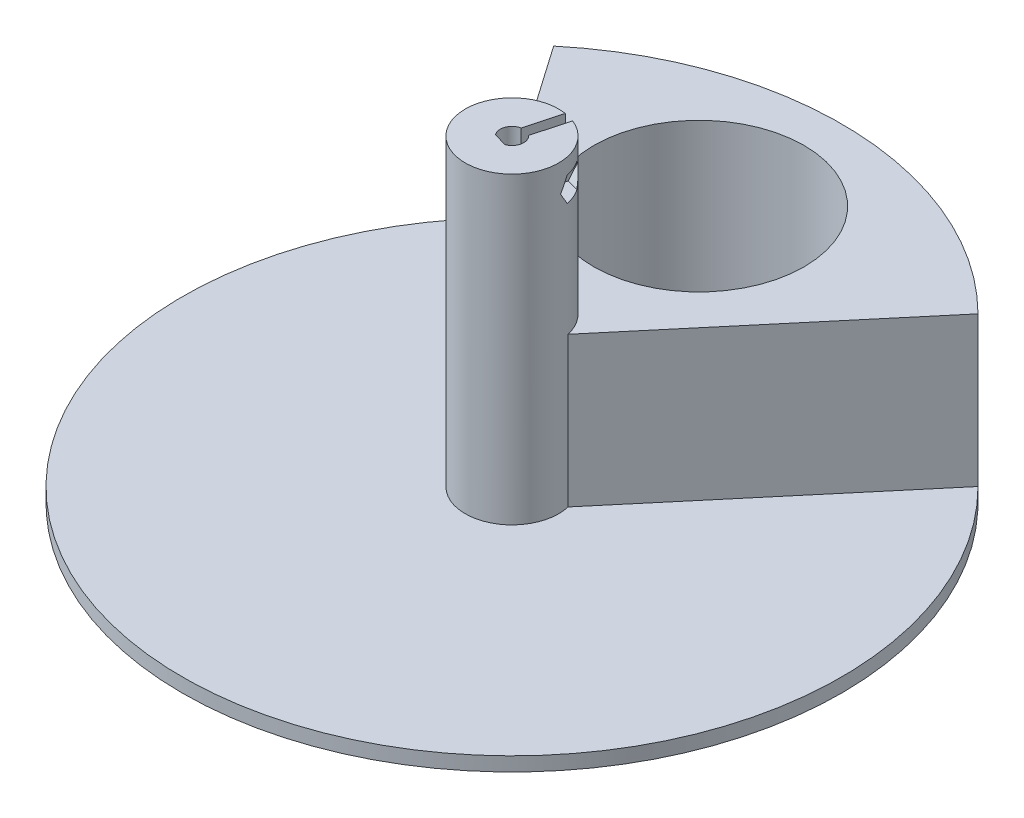
ISO-10303-21;
HEADER;
FILE_DESCRIPTION(('STEP AP214'),'2;1');
FILE_NAME('part.step','',(''),(''),'','','');
FILE_SCHEMA(('AUTOMOTIVE_DESIGN { 1 0 10303 214 1 1 1 1 }'));
ENDSEC;
DATA;
#1=APPLICATION_CONTEXT('core data for automotive mechanical design processes');
#2=APPLICATION_PROTOCOL_DEFINITION('international standard','automotive_design',2000,#1);
#3=PRODUCT_CONTEXT('',#1,'mechanical');
#4=PRODUCT('Part','Part','',(#3));
#5=PRODUCT_RELATED_PRODUCT_CATEGORY('part','',(#4));
#6=PRODUCT_DEFINITION_FORMATION('','',#4);
#7=PRODUCT_DEFINITION_CONTEXT('part definition',#1,'design');
#8=PRODUCT_DEFINITION('design','',#6,#7);
#9=PRODUCT_DEFINITION_SHAPE('','',#8);
#10=(LENGTH_UNIT() NAMED_UNIT(*) SI_UNIT(.MILLI.,.METRE.));
#11=(NAMED_UNIT(*) PLANE_ANGLE_UNIT() SI_UNIT($,.RADIAN.));
#12=(NAMED_UNIT(*) SI_UNIT($,.STERADIAN.) SOLID_ANGLE_UNIT());
#13=UNCERTAINTY_MEASURE_WITH_UNIT(LENGTH_MEASURE(1.E-05),#10,'distance_accuracy_value','');
#14=(GEOMETRIC_REPRESENTATION_CONTEXT(3) GLOBAL_UNCERTAINTY_ASSIGNED_CONTEXT((#13)) GLOBAL_UNIT_ASSIGNED_CONTEXT((#10,
#11,#12)) REPRESENTATION_CONTEXT('',''));
#15=CARTESIAN_POINT('',(0.,0.,0.));
#16=DIRECTION('',(0.,0.,1.));
#17=DIRECTION('',(1.,0.,0.));
#18=AXIS2_PLACEMENT_3D('',#15,#16,#17);
#19=CARTESIAN_POINT('',(12.0838405350801,62.,-2.99039942054655));
#20=DIRECTION('',(-0.964927464953348,0.,-0.262516642098564));
#21=DIRECTION('',(-0.262516642098564,0.,0.964927464953348));
#22=AXIS2_PLACEMENT_3D('',#19,#20,#21);
#23=CYLINDRICAL_SURFACE('',#22,1.55);
#24=CARTESIAN_POINT('',(0.504710955639954,62.,-6.14059912572932));
#25=DIRECTION('',(-0.964927464953348,0.,-0.262516642098564));
#26=DIRECTION('',(-0.262516642098564,0.,0.964927464953348));
#27=AXIS2_PLACEMENT_3D('',#24,#25,#26);
#28=CIRCLE('',#27,1.55);
#29=CARTESIAN_POINT('',(0.0978101603871794,62.,-4.64496155505163));
#30=VERTEX_POINT('',#29);
#31=EDGE_CURVE('E217',#30,#30,#28,.F.);
#32=ORIENTED_EDGE('',*,*,#31,.T.);
#33=EDGE_LOOP('',(#32));
#34=FACE_BOUND('',#33,.T.);
#35=CARTESIAN_POINT('',(-2.14883957298176,62.,-6.86251989150038));
#36=DIRECTION('',(-0.964927464953348,0.,-0.262516642098564));
#37=DIRECTION('',(-0.262516642098564,0.,0.964927464953348));
#38=AXIS2_PLACEMENT_3D('',#35,#36,#37);
#39=CIRCLE('',#38,1.55);
#40=CARTESIAN_POINT('',(-2.55574036823453,62.,-5.36688232082269));
#41=VERTEX_POINT('',#40);
#42=EDGE_CURVE('E193',#41,#41,#39,.T.);
#43=ORIENTED_EDGE('',*,*,#42,.T.);
#44=EDGE_LOOP('',(#43));
#45=FACE_BOUND('',#44,.T.);
#46=ADVANCED_FACE('F38',(#34,#45),#23,.F.);
#47=CARTESIAN_POINT('',(2.67579775178499,62.,-5.54993668100755));
#48=DIRECTION('',(0.964927464953348,0.,0.262516642098564));
#49=DIRECTION('',(0.262516642098564,0.,-0.964927464953348));
#50=AXIS2_PLACEMENT_3D('',#47,#48,#49);
#51=CIRCLE('',#50,1.55);
#52=CARTESIAN_POINT('',(3.08269854703776,62.,-7.04557425168524));
#53=VERTEX_POINT('',#52);
#54=EDGE_CURVE('E221',#53,#53,#51,.F.);
#55=ORIENTED_EDGE('',*,*,#54,.T.);
#56=EDGE_LOOP('',(#55));
#57=FACE_BOUND('',#56,.T.);
#58=CARTESIAN_POINT('',(5.3293482804067,62.,-4.8280159152365));
#59=DIRECTION('',(0.964927464953348,0.,0.262516642098565));
#60=DIRECTION('',(0.262516642098565,0.,-0.964927464953348));
#61=AXIS2_PLACEMENT_3D('',#58,#59,#60);
#62=CIRCLE('',#61,1.55);
#63=CARTESIAN_POINT('',(5.73624907565948,62.,-6.32365348591419));
#64=VERTEX_POINT('',#63);
#65=EDGE_CURVE('E206',#64,#64,#62,.T.);
#66=ORIENTED_EDGE('',*,*,#65,.T.);
#67=EDGE_LOOP('',(#66));
#68=FACE_BOUND('',#67,.T.);
#69=ADVANCED_FACE('F355',(#57,#68),#23,.F.);
#70=CARTESIAN_POINT('',(0.,68.,0.));
#71=DIRECTION('',(0.,-1.,0.));
#72=DIRECTION('',(0.,0.,-1.));
#73=AXIS2_PLACEMENT_3D('',#70,#71,#72);
#74=CYLINDRICAL_SURFACE('',#73,10.);
#75=CARTESIAN_POINT('',(-8.4128944018716,62.,-5.40584940439128));
#76=CARTESIAN_POINT('',(-8.4128933177047,61.836429564872,-5.40585810801379));
#77=CARTESIAN_POINT('',(-8.40543360582333,61.6726981942952,-5.41751535518966));
#78=CARTESIAN_POINT('',(-8.37549125315974,61.3497173095908,-5.46368682018151));
#79=CARTESIAN_POINT('',(-8.35298481801678,61.1904753111223,-5.49823723968637));
#80=CARTESIAN_POINT('',(-8.29277333656487,60.8812808585193,-5.58863497408555));
#81=CARTESIAN_POINT('',(-8.25507913418459,60.7313218643465,-5.64446709250712));
#82=CARTESIAN_POINT('',(-8.16440083669899,60.4448556112467,-5.77484451229425));
#83=CARTESIAN_POINT('',(-8.11142315822704,60.3083427392814,-5.84938195868668));
#84=CARTESIAN_POINT('',(-7.99014270207121,60.0518665768216,-6.01398926154527));
#85=CARTESIAN_POINT('',(-7.92179020363087,59.9319590660187,-6.10410928690612));
#86=CARTESIAN_POINT('',(-7.7705186207467,59.7119461466983,-6.2955456984177));
#87=CARTESIAN_POINT('',(-7.6875981675094,59.6118426008263,-6.39686313633631));
#88=CARTESIAN_POINT('',(-7.50574546192819,59.4303404124941,-6.60937860047187));
#89=CARTESIAN_POINT('',(-7.4064099621458,59.3495874761086,-6.72078100139821));
#90=CARTESIAN_POINT('',(-7.19546692999195,59.2110747134056,-6.94615688705542));
#91=CARTESIAN_POINT('',(-7.08385579958623,59.1533216514821,-7.06013111777734));
#92=CARTESIAN_POINT('',(-6.84001576001128,59.0557630384219,-7.2969581699558));
#93=CARTESIAN_POINT('',(-6.70683516646575,59.0180482248102,-7.41968372104612));
#94=CARTESIAN_POINT('',(-6.43130527290196,58.9667999665144,-7.6597481592123));
#95=CARTESIAN_POINT('',(-6.28895111898366,58.9532794341336,-7.77708413738833));
#96=CARTESIAN_POINT('',(-6.03693135486609,58.9485168301406,-7.97331360598395));
#97=CARTESIAN_POINT('',(-5.92875145293282,58.9522677342299,-8.05406991720388));
#98=CARTESIAN_POINT('',(-5.70975690565685,58.9702488123401,-8.21077324770921));
#99=CARTESIAN_POINT('',(-5.59894131191965,58.9844828154081,-8.28671849870052));
#100=CARTESIAN_POINT('',(-5.3752784979826,59.0225039658131,-8.43352371493823));
#101=CARTESIAN_POINT('',(-5.26242744996954,59.0463114162987,-8.50437249284175));
#102=CARTESIAN_POINT('',(-5.03559753471138,59.1026186547994,-8.64061748727506));
#103=CARTESIAN_POINT('',(-4.92161841728756,59.1351204145777,-8.70601246253046));
#104=CARTESIAN_POINT('',(-4.66298551643691,59.2177283274169,-8.84780609651706));
#105=CARTESIAN_POINT('',(-4.51818142061087,59.2702168558324,-8.92254884187921));
#106=CARTESIAN_POINT('',(-4.22893189020936,59.3868162976722,-9.06322355583294));
#107=CARTESIAN_POINT('',(-4.08448662925818,59.4509320215008,-9.12915185802639));
#108=CARTESIAN_POINT('',(-3.79727171037055,59.590064471052,-9.25230307633056));
#109=CARTESIAN_POINT('',(-3.65450105523137,59.6650743117598,-9.30953144433611));
#110=CARTESIAN_POINT('',(-3.37202410785812,59.8258300541703,-9.41553048138735));
#111=CARTESIAN_POINT('',(-3.23231622203874,59.9115702091253,-9.46430564454905));
#112=CARTESIAN_POINT('',(-2.94321230238699,60.1039563287637,-9.55839286941124));
#113=CARTESIAN_POINT('',(-2.79433860244545,60.2118520162852,-9.60280404061365));
#114=CARTESIAN_POINT('',(-2.57865455276539,60.3854912069074,-9.66209771694344));
#115=CARTESIAN_POINT('',(-2.50805204215669,60.445316131692,-9.68063706340122));
#116=CARTESIAN_POINT('',(-2.37023076619809,60.5693857111045,-9.71529954340095));
#117=CARTESIAN_POINT('',(-2.30301092791949,60.633628948818,-9.73142344633129));
#118=CARTESIAN_POINT('',(-2.15317417113305,60.787607011522,-9.76582815718818));
#119=CARTESIAN_POINT('',(-2.07215628503419,60.8791179940172,-9.783254306536));
#120=CARTESIAN_POINT('',(-1.9221751074127,61.0722998095737,-9.81381988443777));
#121=CARTESIAN_POINT('',(-1.85319107628871,61.1739526786278,-9.82696672267911));
#122=CARTESIAN_POINT('',(-1.75389485109662,61.3535527413387,-9.84507661714961));
#123=CARTESIAN_POINT('',(-1.71830937618729,61.428408633442,-9.85131024455068));
#124=CARTESIAN_POINT('',(-1.65903801682698,61.5828407547058,-9.8614654245262));
#125=CARTESIAN_POINT('',(-1.63533098465436,61.6624083109411,-9.86539108824795));
#126=CARTESIAN_POINT('',(-1.60262630048633,61.825657411876,-9.87075932589874));
#127=CARTESIAN_POINT('',(-1.59379818364142,61.9093753289893,-9.87217329038509));
#128=CARTESIAN_POINT('',(-1.59290224956686,62.0769101940521,-9.87231810211949));
#129=CARTESIAN_POINT('',(-1.60083321277176,62.1607271343521,-9.87104914460492));
#130=CARTESIAN_POINT('',(-1.62986342968643,62.3136757201182,-9.86629140493358));
#131=CARTESIAN_POINT('',(-1.64896158720229,62.3832193012499,-9.8631386192991));
#132=CARTESIAN_POINT('',(-1.69654684572094,62.5188679516977,-9.85506549123324));
#133=CARTESIAN_POINT('',(-1.72503927435549,62.5849710451746,-9.85014414568229));
#134=CARTESIAN_POINT('',(-1.81484170880735,62.7642606241342,-9.83410997753555));
#135=CARTESIAN_POINT('',(-1.88425254927048,62.8731870590131,-9.82118288880022));
#136=CARTESIAN_POINT('',(-2.03746472945284,63.079752112296,-9.79055171061161));
#137=CARTESIAN_POINT('',(-2.12132493932287,63.1773417056833,-9.77282790261213));
#138=CARTESIAN_POINT('',(-2.29610739118356,63.360911229129,-9.73322999098061));
#139=CARTESIAN_POINT('',(-2.3868414665341,63.4470939584077,-9.71145219081766));
#140=CARTESIAN_POINT('',(-2.57407132207992,63.6117137522295,-9.66351475979767));
#141=CARTESIAN_POINT('',(-2.67057239335902,63.6901435229687,-9.63735106399991));
#142=CARTESIAN_POINT('',(-2.86760340595768,63.8402267481727,-9.5805730914493));
#143=CARTESIAN_POINT('',(-2.96813768497953,63.9118726124294,-9.54995392457058));
#144=CARTESIAN_POINT('',(-3.17193454284889,64.0488383441192,-9.48421306625899));
#145=CARTESIAN_POINT('',(-3.27519621720936,64.1141602760495,-9.44909285298794));
#146=CARTESIAN_POINT('',(-3.49511764886139,64.2456424095126,-9.37012599748397));
#147=CARTESIAN_POINT('',(-3.61200248210945,64.3111055194248,-9.32574448375511));
#148=CARTESIAN_POINT('',(-3.8473101031324,64.434691067462,-9.23115869966449));
#149=CARTESIAN_POINT('',(-3.96573312188881,64.492812388719,-9.18095354560575));
#150=CARTESIAN_POINT('',(-4.20326852650853,64.6014363951235,-9.07465962090296));
#151=CARTESIAN_POINT('',(-4.32238009483558,64.6519467196177,-9.01857684696895));
#152=CARTESIAN_POINT('',(-4.56079163898817,64.7449955306222,-8.90038684931695));
#153=CARTESIAN_POINT('',(-4.68009166003145,64.7875316608273,-8.83827785310413));
#154=CARTESIAN_POINT('',(-4.91162272123302,64.8618660881755,-8.71162446072597));
#155=CARTESIAN_POINT('',(-5.02388118248295,64.8941267839696,-8.64740264101615));
#156=CARTESIAN_POINT('',(-5.24733080154822,64.9502479709334,-8.51366388699741));
#157=CARTESIAN_POINT('',(-5.35852212096921,64.9741097541833,-8.4441477691612));
#158=CARTESIAN_POINT('',(-5.5791284344194,65.0126036165023,-8.30003929274634));
#159=CARTESIAN_POINT('',(-5.68854458845144,65.0272419806406,-8.2254504293463));
#160=CARTESIAN_POINT('',(-5.90485962090151,65.0463932851748,-8.07157318897375));
#161=CARTESIAN_POINT('',(-6.01175911469146,65.0509087268084,-7.99228597787049));
#162=CARTESIAN_POINT('',(-6.28314525342205,65.048182402135,-7.78241030778842));
#163=CARTESIAN_POINT('',(-6.44527088423624,65.0326536997896,-7.64861734327049));
#164=CARTESIAN_POINT('',(-6.67920177672104,64.9857131282374,-7.44306102189771));
#165=CARTESIAN_POINT('',(-6.75566086996082,64.9661140508844,-7.37370605881816));
#166=CARTESIAN_POINT('',(-6.9050153440026,64.9186207492173,-7.2340290639295));
#167=CARTESIAN_POINT('',(-6.9779125307883,64.8907307805112,-7.16370754585939));
#168=CARTESIAN_POINT('',(-7.12028328630273,64.8260291516116,-7.02223182153153));
#169=CARTESIAN_POINT('',(-7.18971869589979,64.7891369062128,-6.95107595483479));
#170=CARTESIAN_POINT('',(-7.32386886775416,64.7063956592621,-6.80958449583508));
#171=CARTESIAN_POINT('',(-7.38858602185964,64.6605512398517,-6.73924850331741));
#172=CARTESIAN_POINT('',(-7.51281977127204,64.5598955234037,-6.60047058621116));
#173=CARTESIAN_POINT('',(-7.57233831938319,64.5050876158265,-6.5320279570584));
#174=CARTESIAN_POINT('',(-7.685770496091,64.3866805644796,-6.39817371875005));
#175=CARTESIAN_POINT('',(-7.73968513122042,64.3230830042384,-6.33276156645691));
#176=CARTESIAN_POINT('',(-7.83429479592852,64.1971908270849,-6.215197701876));
#177=CARTESIAN_POINT('',(-7.87577808450791,64.1360076557562,-6.16248647701562));
#178=CARTESIAN_POINT('',(-7.95423025045849,64.007854024559,-6.06088605750504));
#179=CARTESIAN_POINT('',(-7.99119965135563,63.9408842373703,-6.01199641985978));
#180=CARTESIAN_POINT('',(-8.06052692761944,63.8016151367127,-5.91872333519522));
#181=CARTESIAN_POINT('',(-8.09288453772731,63.7293155170475,-5.87434014741796));
#182=CARTESIAN_POINT('',(-8.15292251754533,63.5799843587702,-5.79072535280893));
#183=CARTESIAN_POINT('',(-8.18060318882465,63.5029531256897,-5.75149341386086));
#184=CARTESIAN_POINT('',(-8.25255146256095,63.2783123027787,-5.6481928894496));
#185=CARTESIAN_POINT('',(-8.29126085198487,63.1256910235161,-5.59088832424414));
#186=CARTESIAN_POINT('',(-8.35282291133347,62.811130005151,-5.49849738981401));
#187=CARTESIAN_POINT('',(-8.37570411009331,62.6492076041951,-5.46337105642749));
#188=CARTESIAN_POINT('',(-8.39817850899406,62.4049449350032,-5.42869657303332));
#189=CARTESIAN_POINT('',(-8.40369699638448,62.3243050402151,-5.42014054813371));
#190=CARTESIAN_POINT('',(-8.41105522951756,62.1624566696119,-5.40871477524939));
#191=CARTESIAN_POINT('',(-8.41289494039554,62.0812481884154,-5.40584508115547));
#192=CARTESIAN_POINT('',(-8.4128944018716,62.,-5.40584940439128));
#193=B_SPLINE_CURVE_WITH_KNOTS('',3,(#75,#76,#77,#78,#79,#80,#81,#82,#83,#84,#85,#86,#87,#88,
#89,#90,#91,#92,#93,#94,#95,#96,#97,#98,#99,#100,#101,#102,#103,#104,#105,#106,#107,#108,#109,
#110,#111,#112,#113,#114,#115,#116,#117,#118,#119,#120,#121,#122,#123,#124,#125,#126,#127,#128,
#129,#130,#131,#132,#133,#134,#135,#136,#137,#138,#139,#140,#141,#142,#143,#144,#145,#146,#147,
#148,#149,#150,#151,#152,#153,#154,#155,#156,#157,#158,#159,#160,#161,#162,#163,#164,#165,#166,
#167,#168,#169,#170,#171,#172,#173,#174,#175,#176,#177,#178,#179,#180,#181,#182,#183,#184,#185,
#186,#187,#188,#189,#190,#191,#192),.UNSPECIFIED.,.T.,.F.,(4,2,2,2,2,2,2,2,2,2,2,2,2,2,2,2,2,2,
2,2,2,2,2,2,2,2,2,2,2,2,2,2,2,2,2,2,2,2,2,2,2,2,2,2,2,2,2,2,2,2,2,2,2,2,2,2,2,2,4),(0.,
0.490409957373323,0.981597272038005,1.47243450310305,1.96306595961922,2.45530748615099,
2.947595288065,3.45454137270079,3.96163644315416,4.51450707346836,5.06767267871812,
5.47231393840419,5.87710307033646,6.28275523592045,6.68849947657321,7.20141394785265,
7.71454110829014,8.22734537540929,8.73987617003329,9.30620469656484,9.58919031905686,
9.87208560992677,10.2417261614873,10.610723227752,10.8592879020486,11.1074084590266,
11.3583375306218,11.6092483426299,11.8249975888309,12.0408694007201,12.428033336129,
12.8168136722987,13.1973240005489,13.5781889636556,13.9594751450047,14.3406364297594,
14.7636946271292,15.1868171048289,15.6095120136951,16.0323316290401,16.4318619773778,
16.8313308354786,17.230527190247,17.6296248981042,18.2589950586501,18.5738999156262,
18.8886434142641,19.2063149892441,19.5238243892454,19.8412140024273,20.1585465096008,
20.4305519922711,20.7025258974006,20.9745154394894,21.2464874369858,21.7465495752043,
22.2457080330881,22.4893006051281,22.7328954857451),.UNSPECIFIED.);
#194=CARTESIAN_POINT('',(-8.4128944018716,62.,-5.40584940439128));
#195=VERTEX_POINT('',#194);
#196=EDGE_CURVE('E42',#195,#195,#193,.T.);
#197=ORIENTED_EDGE('',*,*,#196,.T.);
#198=EDGE_LOOP('',(#197));
#199=FACE_BOUND('',#198,.T.);
#200=CARTESIAN_POINT('',(0.,77.7750472443243,0.));
#201=DIRECTION('',(0.227346080973544,0.5,-0.835651697458918));
#202=DIRECTION('',(0.131258321049282,-0.866025403784439,-0.482463732476674));
#203=AXIS2_PLACEMENT_3D('',#200,#201,#202);
#204=ELLIPSE('',#203,20.,10.);
#205=CARTESIAN_POINT('',(8.28131542032079,64.6413774815425,-5.6053380726908));
#206=VERTEX_POINT('',#205);
#207=CARTESIAN_POINT('',(6.37519201066478,62.,-7.70434467214156));
#208=VERTEX_POINT('',#207);
#209=EDGE_CURVE('E322',#206,#208,#204,.T.);
#210=ORIENTED_EDGE('',*,*,#209,.T.);
#211=CARTESIAN_POINT('',(0.,46.2249527556757,0.));
#212=DIRECTION('',(0.227346080973544,-0.5,-0.835651697458918));
#213=DIRECTION('',(-0.131258321049282,-0.866025403784438,0.482463732476674));
#214=AXIS2_PLACEMENT_3D('',#211,#212,#213);
#215=ELLIPSE('',#214,20.,10.);
#216=CARTESIAN_POINT('',(8.28131542032079,59.3586225184575,-5.60533807269081));
#217=VERTEX_POINT('',#216);
#218=EDGE_CURVE('E11',#208,#217,#215,.T.);
#219=ORIENTED_EDGE('',*,*,#218,.T.);
#220=CARTESIAN_POINT('',(0.,59.3586225184575,0.));
#221=DIRECTION('',(0.,-1.,0.));
#222=DIRECTION('',(0.,0.,-1.));
#223=AXIS2_PLACEMENT_3D('',#220,#221,#222);
#224=CIRCLE('',#223,10.);
#225=CARTESIAN_POINT('',(9.79100834789734,59.3586225184575,-2.03375404889688));
#226=VERTEX_POINT('',#225);
#227=EDGE_CURVE('E52',#217,#226,#224,.T.);
#228=ORIENTED_EDGE('',*,*,#227,.T.);
#229=CARTESIAN_POINT('',(0.,67.2095373181541,0.));
#230=DIRECTION('',(-0.227346080973544,-0.5,0.835651697458918));
#231=DIRECTION('',(0.131258321049282,-0.866025403784439,-0.482463732476674));
#232=AXIS2_PLACEMENT_3D('',#229,#230,#231);
#233=ELLIPSE('',#232,20.,10.);
#234=CARTESIAN_POINT('',(9.99205159249529,62.,-0.39862886613018));
#235=VERTEX_POINT('',#234);
#236=EDGE_CURVE('E334',#226,#235,#233,.T.);
#237=ORIENTED_EDGE('',*,*,#236,.T.);
#238=CARTESIAN_POINT('',(0.,56.7904626818459,0.));
#239=DIRECTION('',(-0.227346080973544,0.500000000000001,0.835651697458917));
#240=DIRECTION('',(-0.131258321049283,-0.866025403784438,0.482463732476675));
#241=AXIS2_PLACEMENT_3D('',#238,#239,#240);
#242=ELLIPSE('',#241,19.9999999999999,10.);
#243=CARTESIAN_POINT('',(9.79100834789734,64.6413774815425,-2.03375404889689));
#244=VERTEX_POINT('',#243);
#245=EDGE_CURVE('E331',#235,#244,#242,.T.);
#246=ORIENTED_EDGE('',*,*,#245,.T.);
#247=CARTESIAN_POINT('',(0.,64.6413774815425,0.));
#248=DIRECTION('',(0.,1.,0.));
#249=DIRECTION('',(0.,0.,1.));
#250=AXIS2_PLACEMENT_3D('',#247,#248,#249);
#251=CIRCLE('',#250,10.);
#252=EDGE_CURVE('E328',#244,#206,#251,.T.);
#253=ORIENTED_EDGE('',*,*,#252,.T.);
#254=EDGE_LOOP('',(#210,#219,#228,#237,#246,#253));
#255=FACE_BOUND('',#254,.T.);
#256=CARTESIAN_POINT('',(0.,68.,0.));
#257=DIRECTION('',(0.,1.,0.));
#258=DIRECTION('',(0.,0.,1.));
#259=AXIS2_PLACEMENT_3D('',#256,#257,#258);
#260=CIRCLE('',#259,10.);
#261=CARTESIAN_POINT('',(1.52295774376534,68.,-9.88334961997729));
#262=VERTEX_POINT('',#261);
#263=CARTESIAN_POINT('',(3.69404453991037,68.,-9.29268717525552));
#264=VERTEX_POINT('',#263);
#265=EDGE_CURVE('E276',#262,#264,#260,.T.);
#266=ORIENTED_EDGE('',*,*,#265,.F.);
#267=DIRECTION('',(0.,-1.,0.));
#268=VECTOR('',#267,1.);
#269=CARTESIAN_POINT('',(1.52295774376534,68.,-9.88334961997729));
#270=LINE('',#269,#268);
#271=CARTESIAN_POINT('',(1.52295774376534,48.,-9.88334961997729));
#272=VERTEX_POINT('',#271);
#273=EDGE_CURVE('E239',#262,#272,#270,.T.);
#274=ORIENTED_EDGE('',*,*,#273,.T.);
#275=CARTESIAN_POINT('',(0.,48.,0.));
#276=DIRECTION('',(0.,-1.,0.));
#277=DIRECTION('',(0.,0.,-1.));
#278=AXIS2_PLACEMENT_3D('',#275,#276,#277);
#279=CIRCLE('',#278,10.);
#280=CARTESIAN_POINT('',(3.69404453991037,48.,-9.29268717525552));
#281=VERTEX_POINT('',#280);
#282=EDGE_CURVE('E232',#272,#281,#279,.T.);
#283=ORIENTED_EDGE('',*,*,#282,.T.);
#284=DIRECTION('',(0.,-1.,0.));
#285=VECTOR('',#284,1.);
#286=CARTESIAN_POINT('',(3.69404453991037,68.,-9.29268717525552));
#287=LINE('',#286,#285);
#288=EDGE_CURVE('E236',#281,#264,#287,.F.);
#289=ORIENTED_EDGE('',*,*,#288,.T.);
#290=EDGE_LOOP('',(#266,#274,#283,#289));
#291=FACE_BOUND('',#290,.T.);
#292=CARTESIAN_POINT('',(0.,35.,0.));
#293=DIRECTION('',(0.,-1.,0.));
#294=DIRECTION('',(0.,0.,-1.));
#295=AXIS2_PLACEMENT_3D('',#292,#293,#294);
#296=CIRCLE('',#295,10.);
#297=CARTESIAN_POINT('',(-9.55831560638184,35.,-2.93915000787598));
#298=VERTEX_POINT('',#297);
#299=CARTESIAN_POINT('',(9.74108178229325,35.,-2.26082412201272));
#300=VERTEX_POINT('',#299);
#301=EDGE_CURVE('E248',#298,#300,#296,.T.);
#302=ORIENTED_EDGE('',*,*,#301,.F.);
#303=DIRECTION('',(0.,-1.,0.));
#304=VECTOR('',#303,1.);
#305=CARTESIAN_POINT('',(-9.55831560638184,68.,-2.93915000787598));
#306=LINE('',#305,#304);
#307=CARTESIAN_POINT('',(-9.55831560638184,2.99999999999999,-2.93915000787598));
#308=VERTEX_POINT('',#307);
#309=EDGE_CURVE('E284',#298,#308,#306,.T.);
#310=ORIENTED_EDGE('',*,*,#309,.T.);
#311=CARTESIAN_POINT('',(0.,2.99999999999999,0.));
#312=DIRECTION('',(0.,1.,0.));
#313=DIRECTION('',(0.,0.,1.));
#314=AXIS2_PLACEMENT_3D('',#311,#312,#313);
#315=CIRCLE('',#314,10.);
#316=CARTESIAN_POINT('',(9.74108178229325,2.99999999999999,-2.26082412201272));
#317=VERTEX_POINT('',#316);
#318=EDGE_CURVE('E314',#317,#308,#315,.F.);
#319=ORIENTED_EDGE('',*,*,#318,.F.);
#320=DIRECTION('',(0.,-1.,0.));
#321=VECTOR('',#320,1.);
#322=CARTESIAN_POINT('',(9.74108178229325,68.,-2.26082412201272));
#323=LINE('',#322,#321);
#324=EDGE_CURVE('E281',#317,#300,#323,.F.);
#325=ORIENTED_EDGE('',*,*,#324,.T.);
#326=EDGE_LOOP('',(#302,#310,#319,#325));
#327=FACE_BOUND('',#326,.T.);
#328=ADVANCED_FACE('F351',(#199,#255,#291,#327),#74,.T.);
#329=CARTESIAN_POINT('',(0.,-51.,0.));
#330=DIRECTION('',(0.,1.,0.));
#331=DIRECTION('',(0.,0.,1.));
#332=AXIS2_PLACEMENT_3D('',#329,#330,#331);
#333=CYLINDRICAL_SURFACE('',#332,2.5);
#334=DIRECTION('',(0.,1.,0.));
#335=VECTOR('',#334,1.);
#336=CARTESIAN_POINT('',(1.44512975196001,-51.,2.04));
#337=LINE('',#336,#335);
#338=CARTESIAN_POINT('',(1.44512975196001,0.,2.04));
#339=VERTEX_POINT('',#338);
#340=CARTESIAN_POINT('',(1.44512975196001,13.,2.04));
#341=VERTEX_POINT('',#340);
#342=EDGE_CURVE('E301',#339,#341,#337,.T.);
#343=ORIENTED_EDGE('',*,*,#342,.T.);
#344=CARTESIAN_POINT('',(0.,13.,0.));
#345=DIRECTION('',(0.,-1.,0.));
#346=DIRECTION('',(0.,0.,-1.));
#347=AXIS2_PLACEMENT_3D('',#344,#345,#346);
#348=CIRCLE('',#347,2.5);
#349=CARTESIAN_POINT('',(-1.44512975196001,13.,2.04));
#350=VERTEX_POINT('',#349);
#351=EDGE_CURVE('E242',#350,#341,#348,.T.);
#352=ORIENTED_EDGE('',*,*,#351,.F.);
#353=DIRECTION('',(0.,1.,0.));
#354=VECTOR('',#353,1.);
#355=CARTESIAN_POINT('',(-1.44512975196001,-51.,2.04));
#356=LINE('',#355,#354);
#357=CARTESIAN_POINT('',(-1.44512975196001,0.,2.04));
#358=VERTEX_POINT('',#357);
#359=EDGE_CURVE('E304',#358,#350,#356,.T.);
#360=ORIENTED_EDGE('',*,*,#359,.F.);
#361=CARTESIAN_POINT('',(0.,0.,0.));
#362=DIRECTION('',(0.,1.,0.));
#363=DIRECTION('',(0.,0.,1.));
#364=AXIS2_PLACEMENT_3D('',#361,#362,#363);
#365=CIRCLE('',#364,2.5);
#366=EDGE_CURVE('E311',#339,#358,#365,.T.);
#367=ORIENTED_EDGE('',*,*,#366,.F.);
#368=EDGE_LOOP('',(#343,#352,#360,#367));
#369=FACE_BOUND('',#368,.T.);
#370=ADVANCED_FACE('F354',(#369),#333,.F.);
#371=CARTESIAN_POINT('',(1.44512975196001,-51.,2.04));
#372=DIRECTION('',(0.,0.,1.));
#373=DIRECTION('',(1.,0.,0.));
#374=AXIS2_PLACEMENT_3D('',#371,#372,#373);
#375=PLANE('',#374);
#376=ORIENTED_EDGE('',*,*,#359,.T.);
#377=DIRECTION('',(-1.,0.,0.));
#378=VECTOR('',#377,1.);
#379=CARTESIAN_POINT('',(-1.44512975196001,13.,2.04));
#380=LINE('',#379,#378);
#381=EDGE_CURVE('E245',#341,#350,#380,.T.);
#382=ORIENTED_EDGE('',*,*,#381,.F.);
#383=ORIENTED_EDGE('',*,*,#342,.F.);
#384=DIRECTION('',(1.,0.,0.));
#385=VECTOR('',#384,1.);
#386=CARTESIAN_POINT('',(0.,0.,2.04));
#387=LINE('',#386,#385);
#388=EDGE_CURVE('E308',#358,#339,#387,.T.);
#389=ORIENTED_EDGE('',*,*,#388,.F.);
#390=EDGE_LOOP('',(#376,#382,#383,#389));
#391=FACE_BOUND('',#390,.T.);
#392=ADVANCED_FACE('F443',(#391),#375,.F.);
#393=CARTESIAN_POINT('',(-45.1962312914564,2.99999999999999,-54.1068450110444));
#394=DIRECTION('',(0.820581814252983,0.,-0.57152907722817));
#395=DIRECTION('',(-0.57152907722817,0.,-0.820581814252983));
#396=AXIS2_PLACEMENT_3D('',#393,#394,#395);
#397=PLANE('',#396);
#398=ORIENTED_EDGE('',*,*,#309,.F.);
#399=DIRECTION('',(0.57152907722817,0.,0.820581814252983));
#400=VECTOR('',#399,1.);
#401=CARTESIAN_POINT('',(-45.1962312914564,35.,-54.1068450110444));
#402=LINE('',#401,#400);
#403=CARTESIAN_POINT('',(-45.1962312914564,35.,-54.1068450110444));
#404=VERTEX_POINT('',#403);
#405=EDGE_CURVE('E254',#404,#298,#402,.T.);
#406=ORIENTED_EDGE('',*,*,#405,.F.);
#407=DIRECTION('',(0.,1.,0.));
#408=VECTOR('',#407,1.);
#409=CARTESIAN_POINT('',(-45.1962312914564,2.99999999999999,-54.1068450110444));
#410=LINE('',#409,#408);
#411=CARTESIAN_POINT('',(-45.1962312914564,2.99999999999999,-54.1068450110444));
#412=VERTEX_POINT('',#411);
#413=EDGE_CURVE('E295',#412,#404,#410,.T.);
#414=ORIENTED_EDGE('',*,*,#413,.F.);
#415=DIRECTION('',(-0.57152907722817,0.,-0.820581814252983));
#416=VECTOR('',#415,1.);
#417=CARTESIAN_POINT('',(-45.1962312914564,2.99999999999999,-54.1068450110444));
#418=LINE('',#417,#416);
#419=EDGE_CURVE('E292',#308,#412,#418,.T.);
#420=ORIENTED_EDGE('',*,*,#419,.F.);
#421=EDGE_LOOP('',(#398,#406,#414,#420));
#422=FACE_BOUND('',#421,.T.);
#423=ADVANCED_FACE('F370',(#422),#397,.F.);
#424=CARTESIAN_POINT('',(-0.557111741909901,2.99999999999999,9.98446926516508));
#425=DIRECTION('',(-0.765330836698612,0.,-0.643637095262697));
#426=DIRECTION('',(-0.643637095262697,0.,0.765330836698612));
#427=AXIS2_PLACEMENT_3D('',#424,#425,#426);
#428=PLANE('',#427);
#429=DIRECTION('',(0.,1.,0.));
#430=VECTOR('',#429,1.);
#431=CARTESIAN_POINT('',(49.8037687085436,2.99999999999999,-49.8982426787346));
#432=LINE('',#431,#430);
#433=CARTESIAN_POINT('',(49.8037687085436,2.99999999999999,-49.8982426787346));
#434=VERTEX_POINT('',#433);
#435=CARTESIAN_POINT('',(49.8037687085436,35.,-49.8982426787346));
#436=VERTEX_POINT('',#435);
#437=EDGE_CURVE('E294',#434,#436,#432,.T.);
#438=ORIENTED_EDGE('',*,*,#437,.T.);
#439=DIRECTION('',(0.643637095262697,0.,-0.765330836698612));
#440=VECTOR('',#439,1.);
#441=CARTESIAN_POINT('',(49.8037687085436,35.,-49.8982426787346));
#442=LINE('',#441,#440);
#443=EDGE_CURVE('E250',#300,#436,#442,.T.);
#444=ORIENTED_EDGE('',*,*,#443,.F.);
#445=ORIENTED_EDGE('',*,*,#324,.F.);
#446=DIRECTION('',(-0.643637095262697,0.,0.765330836698612));
#447=VECTOR('',#446,1.);
#448=CARTESIAN_POINT('',(-0.557111741909901,2.99999999999999,9.98446926516508));
#449=LINE('',#448,#447);
#450=EDGE_CURVE('E289',#434,#317,#449,.T.);
#451=ORIENTED_EDGE('',*,*,#450,.F.);
#452=EDGE_LOOP('',(#438,#444,#445,#451));
#453=FACE_BOUND('',#452,.T.);
#454=ADVANCED_FACE('F376',(#453),#428,.F.);
#455=CARTESIAN_POINT('',(0.,38.,0.));
#456=DIRECTION('',(0.,-1.,0.));
#457=DIRECTION('',(0.,0.,-1.));
#458=AXIS2_PLACEMENT_3D('',#455,#456,#457);
#459=CYLINDRICAL_SURFACE('',#458,70.5);
#460=ORIENTED_EDGE('',*,*,#413,.T.);
#461=CARTESIAN_POINT('',(0.,35.,0.));
#462=DIRECTION('',(0.,1.,0.));
#463=DIRECTION('',(0.,0.,1.));
#464=AXIS2_PLACEMENT_3D('',#461,#462,#463);
#465=CIRCLE('',#464,70.5);
#466=EDGE_CURVE('E252',#436,#404,#465,.T.);
#467=ORIENTED_EDGE('',*,*,#466,.F.);
#468=ORIENTED_EDGE('',*,*,#437,.F.);
#469=CARTESIAN_POINT('',(0.,2.99999999999999,0.));
#470=DIRECTION('',(0.,1.,0.));
#471=DIRECTION('',(0.,0.,1.));
#472=AXIS2_PLACEMENT_3D('',#469,#470,#471);
#473=CIRCLE('',#472,70.5);
#474=EDGE_CURVE('E286',#412,#434,#473,.T.);
#475=ORIENTED_EDGE('',*,*,#474,.F.);
#476=EDGE_LOOP('',(#460,#467,#468,#475));
#477=FACE_BOUND('',#476,.T.);
#478=CARTESIAN_POINT('',(0.,0.,0.));
#479=DIRECTION('',(0.,1.,0.));
#480=DIRECTION('',(0.,0.,1.));
#481=AXIS2_PLACEMENT_3D('',#478,#479,#480);
#482=CIRCLE('',#481,70.5);
#483=CARTESIAN_POINT('',(0.,0.,70.5));
#484=VERTEX_POINT('',#483);
#485=EDGE_CURVE('E303',#484,#484,#482,.T.);
#486=ORIENTED_EDGE('',*,*,#485,.T.);
#487=EDGE_LOOP('',(#486));
#488=FACE_BOUND('',#487,.T.);
#489=ADVANCED_FACE('F40',(#477,#488),#459,.T.);
#490=CARTESIAN_POINT('',(0.,0.,0.));
#491=DIRECTION('',(0.,1.,0.));
#492=DIRECTION('',(0.,0.,1.));
#493=AXIS2_PLACEMENT_3D('',#490,#491,#492);
#494=PLANE('',#493);
#495=CARTESIAN_POINT('',(0.,0.,-40.));
#496=DIRECTION('',(0.,1.,0.));
#497=DIRECTION('',(0.,0.,1.));
#498=AXIS2_PLACEMENT_3D('',#495,#496,#497);
#499=CIRCLE('',#498,22.5);
#500=CARTESIAN_POINT('',(0.,0.,-17.5));
#501=VERTEX_POINT('',#500);
#502=EDGE_CURVE('E298',#501,#501,#499,.T.);
#503=ORIENTED_EDGE('',*,*,#502,.T.);
#504=EDGE_LOOP('',(#503));
#505=FACE_BOUND('',#504,.T.);
#506=ORIENTED_EDGE('',*,*,#388,.T.);
#507=ORIENTED_EDGE('',*,*,#366,.T.);
#508=EDGE_LOOP('',(#506,#507));
#509=FACE_BOUND('',#508,.T.);
#510=ORIENTED_EDGE('',*,*,#485,.F.);
#511=EDGE_LOOP('',(#510));
#512=FACE_BOUND('',#511,.T.);
#513=ADVANCED_FACE('F380',(#505,#509,#512),#494,.F.);
#514=CARTESIAN_POINT('',(0.,-51.,-40.));
#515=DIRECTION('',(0.,1.,0.));
#516=DIRECTION('',(0.,0.,1.));
#517=AXIS2_PLACEMENT_3D('',#514,#515,#516);
#518=CYLINDRICAL_SURFACE('',#517,22.5);
#519=CARTESIAN_POINT('',(0.,35.,-40.));
#520=DIRECTION('',(0.,-1.,0.));
#521=DIRECTION('',(0.,0.,-1.));
#522=AXIS2_PLACEMENT_3D('',#519,#520,#521);
#523=CIRCLE('',#522,22.5);
#524=CARTESIAN_POINT('',(0.,35.,-62.5));
#525=VERTEX_POINT('',#524);
#526=EDGE_CURVE('E257',#525,#525,#523,.F.);
#527=ORIENTED_EDGE('',*,*,#526,.T.);
#528=EDGE_LOOP('',(#527));
#529=FACE_BOUND('',#528,.T.);
#530=ORIENTED_EDGE('',*,*,#502,.F.);
#531=EDGE_LOOP('',(#530));
#532=FACE_BOUND('',#531,.T.);
#533=ADVANCED_FACE('F384',(#529,#532),#518,.F.);
#534=CARTESIAN_POINT('',(0.,2.99999999999999,0.));
#535=DIRECTION('',(0.,1.,0.));
#536=DIRECTION('',(0.,0.,1.));
#537=AXIS2_PLACEMENT_3D('',#534,#535,#536);
#538=PLANE('',#537);
#539=ORIENTED_EDGE('',*,*,#318,.T.);
#540=ORIENTED_EDGE('',*,*,#419,.T.);
#541=ORIENTED_EDGE('',*,*,#474,.T.);
#542=ORIENTED_EDGE('',*,*,#450,.T.);
#543=EDGE_LOOP('',(#539,#540,#541,#542));
#544=FACE_BOUND('',#543,.T.);
#545=ADVANCED_FACE('F373',(#544),#538,.T.);
#546=CARTESIAN_POINT('',(0.,68.,0.));
#547=DIRECTION('',(0.,1.,0.));
#548=DIRECTION('',(0.,0.,1.));
#549=AXIS2_PLACEMENT_3D('',#546,#547,#548);
#550=PLANE('',#549);
#551=DIRECTION('',(-0.262516642098564,0.,0.964927464953348));
#552=VECTOR('',#551,1.);
#553=CARTESIAN_POINT('',(-0.496518117559523,68.,-2.46040032493396));
#554=LINE('',#553,#552);
#555=CARTESIAN_POINT('',(-0.496518117559523,68.,-2.46040032493396));
#556=VERTEX_POINT('',#555);
#557=EDGE_CURVE('E220',#262,#556,#554,.T.);
#558=ORIENTED_EDGE('',*,*,#557,.F.);
#559=ORIENTED_EDGE('',*,*,#265,.T.);
#560=DIRECTION('',(0.262516642098564,0.,-0.964927464953348));
#561=VECTOR('',#560,1.);
#562=CARTESIAN_POINT('',(1.67456867858551,68.,-1.86973788021219));
#563=LINE('',#562,#561);
#564=CARTESIAN_POINT('',(1.67456867858551,68.,-1.86973788021219));
#565=VERTEX_POINT('',#564);
#566=EDGE_CURVE('E225',#565,#264,#563,.T.);
#567=ORIENTED_EDGE('',*,*,#566,.F.);
#568=CARTESIAN_POINT('',(0.,68.,0.));
#569=DIRECTION('',(0.,1.,0.));
#570=DIRECTION('',(0.,0.,-1.));
#571=AXIS2_PLACEMENT_3D('',#568,#569,#570);
#572=CIRCLE('',#571,2.51);
#573=CARTESIAN_POINT('',(0.826538726958779,68.,2.37000711662167));
#574=VERTEX_POINT('',#573);
#575=EDGE_CURVE('E269',#574,#565,#572,.T.);
#576=ORIENTED_EDGE('',*,*,#575,.F.);
#577=DIRECTION('',(0.957327710786726,0.,0.289004591935574));
#578=VECTOR('',#577,1.);
#579=CARTESIAN_POINT('',(-1.99989737021721,68.,1.51674338917244));
#580=LINE('',#579,#578);
#581=CARTESIAN_POINT('',(-1.99989737021721,68.,1.51674338917244));
#582=VERTEX_POINT('',#581);
#583=EDGE_CURVE('E265',#582,#574,#580,.T.);
#584=ORIENTED_EDGE('',*,*,#583,.F.);
#585=EDGE_CURVE('E260',#556,#582,#572,.T.);
#586=ORIENTED_EDGE('',*,*,#585,.F.);
#587=EDGE_LOOP('',(#558,#559,#567,#576,#584,#586));
#588=FACE_BOUND('',#587,.T.);
#589=ADVANCED_FACE('F433',(#588),#550,.T.);
#590=CARTESIAN_POINT('',(0.,38.,0.));
#591=DIRECTION('',(0.,1.,0.));
#592=DIRECTION('',(0.,0.,1.));
#593=AXIS2_PLACEMENT_3D('',#590,#591,#592);
#594=CYLINDRICAL_SURFACE('',#593,2.51);
#595=ORIENTED_EDGE('',*,*,#575,.T.);
#596=DIRECTION('',(0.,1.,0.));
#597=VECTOR('',#596,1.);
#598=CARTESIAN_POINT('',(1.67456867858551,48.,-1.86973788021219));
#599=LINE('',#598,#597);
#600=CARTESIAN_POINT('',(1.67456867858551,48.,-1.86973788021219));
#601=VERTEX_POINT('',#600);
#602=EDGE_CURVE('E230',#601,#565,#599,.T.);
#603=ORIENTED_EDGE('',*,*,#602,.F.);
#604=CARTESIAN_POINT('',(0.,48.,0.));
#605=DIRECTION('',(0.,-1.,0.));
#606=DIRECTION('',(0.,0.,-1.));
#607=AXIS2_PLACEMENT_3D('',#604,#605,#606);
#608=CIRCLE('',#607,2.51);
#609=CARTESIAN_POINT('',(-0.496518117559524,48.,-2.46040032493396));
#610=VERTEX_POINT('',#609);
#611=EDGE_CURVE('E319',#601,#610,#608,.F.);
#612=ORIENTED_EDGE('',*,*,#611,.T.);
#613=DIRECTION('',(0.,1.,0.));
#614=VECTOR('',#613,1.);
#615=CARTESIAN_POINT('',(-0.496518117559523,48.,-2.46040032493396));
#616=LINE('',#615,#614);
#617=EDGE_CURVE('E68',#610,#556,#616,.T.);
#618=ORIENTED_EDGE('',*,*,#617,.T.);
#619=ORIENTED_EDGE('',*,*,#585,.T.);
#620=DIRECTION('',(0.,1.,0.));
#621=VECTOR('',#620,1.);
#622=CARTESIAN_POINT('',(-1.99989737021721,38.,1.51674338917244));
#623=LINE('',#622,#621);
#624=CARTESIAN_POINT('',(-1.99989737021721,38.,1.51674338917244));
#625=VERTEX_POINT('',#624);
#626=EDGE_CURVE('E268',#625,#582,#623,.T.);
#627=ORIENTED_EDGE('',*,*,#626,.F.);
#628=CARTESIAN_POINT('',(0.,38.,0.));
#629=DIRECTION('',(0.,1.,0.));
#630=DIRECTION('',(0.,0.,-1.));
#631=AXIS2_PLACEMENT_3D('',#628,#629,#630);
#632=CIRCLE('',#631,2.51);
#633=CARTESIAN_POINT('',(0.826538726958779,38.,2.37000711662167));
#634=VERTEX_POINT('',#633);
#635=EDGE_CURVE('E261',#634,#625,#632,.T.);
#636=ORIENTED_EDGE('',*,*,#635,.F.);
#637=DIRECTION('',(0.,1.,0.));
#638=VECTOR('',#637,1.);
#639=CARTESIAN_POINT('',(0.826538726958779,38.,2.37000711662167));
#640=LINE('',#639,#638);
#641=EDGE_CURVE('E274',#634,#574,#640,.T.);
#642=ORIENTED_EDGE('',*,*,#641,.T.);
#643=EDGE_LOOP('',(#595,#603,#612,#618,#619,#627,#636,#642));
#644=FACE_BOUND('',#643,.T.);
#645=ADVANCED_FACE('F429',(#644),#594,.F.);
#646=CARTESIAN_POINT('',(-1.99989737021721,38.,1.51674338917244));
#647=DIRECTION('',(-0.289004591935574,0.,0.957327710786725));
#648=DIRECTION('',(0.957327710786726,0.,0.289004591935574));
#649=AXIS2_PLACEMENT_3D('',#646,#647,#648);
#650=PLANE('',#649);
#651=ORIENTED_EDGE('',*,*,#583,.T.);
#652=ORIENTED_EDGE('',*,*,#641,.F.);
#653=DIRECTION('',(0.957327710786726,0.,0.289004591935574));
#654=VECTOR('',#653,1.);
#655=CARTESIAN_POINT('',(-1.99989737021721,38.,1.51674338917244));
#656=LINE('',#655,#654);
#657=EDGE_CURVE('E264',#625,#634,#656,.T.);
#658=ORIENTED_EDGE('',*,*,#657,.F.);
#659=ORIENTED_EDGE('',*,*,#626,.T.);
#660=EDGE_LOOP('',(#651,#652,#658,#659));
#661=FACE_BOUND('',#660,.T.);
#662=ADVANCED_FACE('F425',(#661),#650,.F.);
#663=CARTESIAN_POINT('',(0.,38.,0.));
#664=DIRECTION('',(0.,-1.,0.));
#665=DIRECTION('',(0.,0.,-1.));
#666=AXIS2_PLACEMENT_3D('',#663,#664,#665);
#667=PLANE('',#666);
#668=ORIENTED_EDGE('',*,*,#635,.T.);
#669=ORIENTED_EDGE('',*,*,#657,.T.);
#670=EDGE_LOOP('',(#668,#669));
#671=FACE_BOUND('',#670,.T.);
#672=ADVANCED_FACE('F422',(#671),#667,.F.);
#673=CARTESIAN_POINT('',(0.,35.,0.));
#674=DIRECTION('',(0.,-1.,0.));
#675=DIRECTION('',(0.,0.,-1.));
#676=AXIS2_PLACEMENT_3D('',#673,#674,#675);
#677=PLANE('',#676);
#678=ORIENTED_EDGE('',*,*,#301,.T.);
#679=ORIENTED_EDGE('',*,*,#443,.T.);
#680=ORIENTED_EDGE('',*,*,#466,.T.);
#681=ORIENTED_EDGE('',*,*,#405,.T.);
#682=EDGE_LOOP('',(#678,#679,#680,#681));
#683=FACE_BOUND('',#682,.T.);
#684=ORIENTED_EDGE('',*,*,#526,.F.);
#685=EDGE_LOOP('',(#684));
#686=FACE_BOUND('',#685,.T.);
#687=ADVANCED_FACE('F364',(#683,#686),#677,.F.);
#688=CARTESIAN_POINT('',(0.,13.,0.));
#689=DIRECTION('',(0.,-1.,0.));
#690=DIRECTION('',(0.,0.,-1.));
#691=AXIS2_PLACEMENT_3D('',#688,#689,#690);
#692=PLANE('',#691);
#693=ORIENTED_EDGE('',*,*,#351,.T.);
#694=ORIENTED_EDGE('',*,*,#381,.T.);
#695=EDGE_LOOP('',(#693,#694));
#696=FACE_BOUND('',#695,.T.);
#697=ADVANCED_FACE('F415',(#696),#692,.T.);
#698=CARTESIAN_POINT('',(-0.496518117559523,48.,-2.46040032493396));
#699=DIRECTION('',(-0.964927464953348,0.,-0.262516642098564));
#700=DIRECTION('',(-0.262516642098564,0.,0.964927464953348));
#701=AXIS2_PLACEMENT_3D('',#698,#699,#700);
#702=PLANE('',#701);
#703=ORIENTED_EDGE('',*,*,#31,.F.);
#704=EDGE_LOOP('',(#703));
#705=FACE_BOUND('',#704,.T.);
#706=ORIENTED_EDGE('',*,*,#557,.T.);
#707=ORIENTED_EDGE('',*,*,#617,.F.);
#708=DIRECTION('',(-0.262516642098564,0.,0.964927464953348));
#709=VECTOR('',#708,1.);
#710=CARTESIAN_POINT('',(-0.496518117559523,48.,-2.46040032493396));
#711=LINE('',#710,#709);
#712=EDGE_CURVE('E222',#272,#610,#711,.T.);
#713=ORIENTED_EDGE('',*,*,#712,.F.);
#714=ORIENTED_EDGE('',*,*,#273,.F.);
#715=EDGE_LOOP('',(#706,#707,#713,#714));
#716=FACE_BOUND('',#715,.T.);
#717=ADVANCED_FACE('F411',(#705,#716),#702,.F.);
#718=CARTESIAN_POINT('',(1.67456867858551,48.,-1.86973788021219));
#719=DIRECTION('',(0.964927464953348,0.,0.262516642098564));
#720=DIRECTION('',(0.262516642098564,0.,-0.964927464953348));
#721=AXIS2_PLACEMENT_3D('',#718,#719,#720);
#722=PLANE('',#721);
#723=ORIENTED_EDGE('',*,*,#54,.F.);
#724=EDGE_LOOP('',(#723));
#725=FACE_BOUND('',#724,.T.);
#726=DIRECTION('',(0.262516642098564,0.,-0.964927464953348));
#727=VECTOR('',#726,1.);
#728=CARTESIAN_POINT('',(1.67456867858551,48.,-1.86973788021219));
#729=LINE('',#728,#727);
#730=EDGE_CURVE('E224',#601,#281,#729,.T.);
#731=ORIENTED_EDGE('',*,*,#730,.F.);
#732=ORIENTED_EDGE('',*,*,#602,.T.);
#733=ORIENTED_EDGE('',*,*,#566,.T.);
#734=ORIENTED_EDGE('',*,*,#288,.F.);
#735=EDGE_LOOP('',(#731,#732,#733,#734));
#736=FACE_BOUND('',#735,.T.);
#737=ADVANCED_FACE('F407',(#725,#736),#722,.F.);
#738=CARTESIAN_POINT('',(0.,48.,0.));
#739=DIRECTION('',(0.,-1.,0.));
#740=DIRECTION('',(0.,0.,-1.));
#741=AXIS2_PLACEMENT_3D('',#738,#739,#740);
#742=PLANE('',#741);
#743=ORIENTED_EDGE('',*,*,#712,.T.);
#744=ORIENTED_EDGE('',*,*,#611,.F.);
#745=ORIENTED_EDGE('',*,*,#730,.T.);
#746=ORIENTED_EDGE('',*,*,#282,.F.);
#747=EDGE_LOOP('',(#743,#744,#745,#746));
#748=FACE_BOUND('',#747,.T.);
#749=ADVANCED_FACE('F404',(#748),#742,.F.);
#750=CARTESIAN_POINT('',(5.72968615960701,59.3586225184575,-6.29953029929036));
#751=DIRECTION('',(0.227346080973544,-0.5,-0.835651697458918));
#752=DIRECTION('',(0.,0.858122469141412,-0.513445058360334));
#753=AXIS2_PLACEMENT_3D('',#750,#751,#752);
#754=PLANE('',#753);
#755=DIRECTION('',(0.964927464953348,0.,0.262516642098564));
#756=VECTOR('',#755,1.);
#757=CARTESIAN_POINT('',(6.13002403880732,62.,-7.77104468334421));
#758=LINE('',#757,#756);
#759=CARTESIAN_POINT('',(6.13002403880732,62.,-7.77104468334421));
#760=VERTEX_POINT('',#759);
#761=EDGE_CURVE('E60',#760,#208,#758,.T.);
#762=ORIENTED_EDGE('',*,*,#761,.F.);
#763=DIRECTION('',(0.131258321049283,0.866025403784438,-0.482463732476674));
#764=VECTOR('',#763,1.);
#765=CARTESIAN_POINT('',(5.72968615960701,59.3586225184575,-6.29953029929036));
#766=LINE('',#765,#764);
#767=CARTESIAN_POINT('',(5.72968615960701,59.3586225184575,-6.29953029929036));
#768=VERTEX_POINT('',#767);
#769=EDGE_CURVE('E173',#768,#760,#766,.T.);
#770=ORIENTED_EDGE('',*,*,#769,.F.);
#771=DIRECTION('',(0.964927464953348,0.,0.262516642098564));
#772=VECTOR('',#771,1.);
#773=CARTESIAN_POINT('',(5.72968615960701,59.3586225184575,-6.29953029929036));
#774=LINE('',#773,#772);
#775=EDGE_CURVE('E204',#768,#217,#774,.T.);
#776=ORIENTED_EDGE('',*,*,#775,.T.);
#777=ORIENTED_EDGE('',*,*,#218,.F.);
#778=EDGE_LOOP('',(#762,#770,#776,#777));
#779=FACE_BOUND('',#778,.T.);
#780=ADVANCED_FACE('F170',(#779),#754,.F.);
#781=CARTESIAN_POINT('',(4.92901040120639,59.3586225184575,-3.35650153118264));
#782=DIRECTION('',(0.,-1.,0.));
#783=DIRECTION('',(0.,0.,-1.));
#784=AXIS2_PLACEMENT_3D('',#781,#782,#783);
#785=PLANE('',#784);
#786=ORIENTED_EDGE('',*,*,#775,.F.);
#787=DIRECTION('',(0.262516642098564,0.,-0.964927464953348));
#788=VECTOR('',#787,1.);
#789=CARTESIAN_POINT('',(4.92901040120639,59.3586225184575,-3.35650153118264));
#790=LINE('',#789,#788);
#791=CARTESIAN_POINT('',(4.92901040120639,59.3586225184575,-3.35650153118264));
#792=VERTEX_POINT('',#791);
#793=EDGE_CURVE('E177',#792,#768,#790,.T.);
#794=ORIENTED_EDGE('',*,*,#793,.F.);
#795=DIRECTION('',(0.964927464953348,0.,0.262516642098564));
#796=VECTOR('',#795,1.);
#797=CARTESIAN_POINT('',(4.92901040120639,59.3586225184575,-3.35650153118264));
#798=LINE('',#797,#796);
#799=EDGE_CURVE('E207',#792,#226,#798,.T.);
#800=ORIENTED_EDGE('',*,*,#799,.T.);
#801=ORIENTED_EDGE('',*,*,#227,.F.);
#802=EDGE_LOOP('',(#786,#794,#800,#801));
#803=FACE_BOUND('',#802,.T.);
#804=ADVANCED_FACE('F527',(#803),#785,.F.);
#805=CARTESIAN_POINT('',(4.52867252200608,62.,-1.88498714712879));
#806=DIRECTION('',(-0.227346080973544,-0.5,0.835651697458918));
#807=DIRECTION('',(0.,-0.858122469141412,-0.513445058360333));
#808=AXIS2_PLACEMENT_3D('',#805,#806,#807);
#809=PLANE('',#808);
#810=ORIENTED_EDGE('',*,*,#799,.F.);
#811=DIRECTION('',(0.131258321049282,-0.866025403784439,-0.482463732476674));
#812=VECTOR('',#811,1.);
#813=CARTESIAN_POINT('',(4.52867252200608,62.,-1.88498714712879));
#814=LINE('',#813,#812);
#815=CARTESIAN_POINT('',(4.52867252200608,62.,-1.88498714712879));
#816=VERTEX_POINT('',#815);
#817=EDGE_CURVE('E201',#816,#792,#814,.T.);
#818=ORIENTED_EDGE('',*,*,#817,.F.);
#819=DIRECTION('',(0.964927464953348,0.,0.262516642098564));
#820=VECTOR('',#819,1.);
#821=CARTESIAN_POINT('',(4.52867252200608,62.,-1.88498714712879));
#822=LINE('',#821,#820);
#823=EDGE_CURVE('E210',#816,#235,#822,.T.);
#824=ORIENTED_EDGE('',*,*,#823,.T.);
#825=ORIENTED_EDGE('',*,*,#236,.F.);
#826=EDGE_LOOP('',(#810,#818,#824,#825));
#827=FACE_BOUND('',#826,.T.);
#828=ADVANCED_FACE('F530',(#827),#809,.F.);
#829=CARTESIAN_POINT('',(4.92901040120639,64.6413774815425,-3.35650153118265));
#830=DIRECTION('',(-0.227346080973544,0.500000000000001,0.835651697458917));
#831=DIRECTION('',(0.,-0.858122469141411,0.513445058360335));
#832=AXIS2_PLACEMENT_3D('',#829,#830,#831);
#833=PLANE('',#832);
#834=ORIENTED_EDGE('',*,*,#823,.F.);
#835=DIRECTION('',(-0.131258321049282,-0.866025403784438,0.482463732476675));
#836=VECTOR('',#835,1.);
#837=CARTESIAN_POINT('',(4.92901040120639,64.6413774815425,-3.35650153118265));
#838=LINE('',#837,#836);
#839=CARTESIAN_POINT('',(4.92901040120639,64.6413774815425,-3.35650153118265));
#840=VERTEX_POINT('',#839);
#841=EDGE_CURVE('E198',#840,#816,#838,.T.);
#842=ORIENTED_EDGE('',*,*,#841,.F.);
#843=DIRECTION('',(0.964927464953348,0.,0.262516642098564));
#844=VECTOR('',#843,1.);
#845=CARTESIAN_POINT('',(4.92901040120639,64.6413774815425,-3.35650153118265));
#846=LINE('',#845,#844);
#847=EDGE_CURVE('E213',#840,#244,#846,.T.);
#848=ORIENTED_EDGE('',*,*,#847,.T.);
#849=ORIENTED_EDGE('',*,*,#245,.F.);
#850=EDGE_LOOP('',(#834,#842,#848,#849));
#851=FACE_BOUND('',#850,.T.);
#852=ADVANCED_FACE('F534',(#851),#833,.F.);
#853=CARTESIAN_POINT('',(5.72968615960701,64.6413774815425,-6.29953029929036));
#854=DIRECTION('',(0.,1.,0.));
#855=DIRECTION('',(0.,0.,1.));
#856=AXIS2_PLACEMENT_3D('',#853,#854,#855);
#857=PLANE('',#856);
#858=ORIENTED_EDGE('',*,*,#847,.F.);
#859=DIRECTION('',(-0.262516642098564,0.,0.964927464953348));
#860=VECTOR('',#859,1.);
#861=CARTESIAN_POINT('',(5.72968615960701,64.6413774815425,-6.29953029929036));
#862=LINE('',#861,#860);
#863=CARTESIAN_POINT('',(5.72968615960701,64.6413774815425,-6.29953029929036));
#864=VERTEX_POINT('',#863);
#865=EDGE_CURVE('E186',#864,#840,#862,.T.);
#866=ORIENTED_EDGE('',*,*,#865,.F.);
#867=DIRECTION('',(0.964927464953348,0.,0.262516642098564));
#868=VECTOR('',#867,1.);
#869=CARTESIAN_POINT('',(5.72968615960701,64.6413774815425,-6.29953029929036));
#870=LINE('',#869,#868);
#871=EDGE_CURVE('E176',#864,#206,#870,.T.);
#872=ORIENTED_EDGE('',*,*,#871,.T.);
#873=ORIENTED_EDGE('',*,*,#252,.F.);
#874=EDGE_LOOP('',(#858,#866,#872,#873));
#875=FACE_BOUND('',#874,.T.);
#876=ADVANCED_FACE('F538',(#875),#857,.F.);
#877=CARTESIAN_POINT('',(6.13002403880732,62.,-7.77104468334421));
#878=DIRECTION('',(0.227346080973544,0.5,-0.835651697458918));
#879=DIRECTION('',(0.,0.858122469141412,0.513445058360333));
#880=AXIS2_PLACEMENT_3D('',#877,#878,#879);
#881=PLANE('',#880);
#882=ORIENTED_EDGE('',*,*,#871,.F.);
#883=DIRECTION('',(-0.131258321049282,0.866025403784439,0.482463732476674));
#884=VECTOR('',#883,1.);
#885=CARTESIAN_POINT('',(6.13002403880732,62.,-7.77104468334421));
#886=LINE('',#885,#884);
#887=EDGE_CURVE('E180',#760,#864,#886,.T.);
#888=ORIENTED_EDGE('',*,*,#887,.F.);
#889=ORIENTED_EDGE('',*,*,#761,.T.);
#890=ORIENTED_EDGE('',*,*,#209,.F.);
#891=EDGE_LOOP('',(#882,#888,#889,#890));
#892=FACE_BOUND('',#891,.T.);
#893=ADVANCED_FACE('F181',(#892),#881,.F.);
#894=CARTESIAN_POINT('',(3.73909392669422,0.,1.01725198813195));
#895=DIRECTION('',(0.964927464953348,0.,0.262516642098565));
#896=DIRECTION('',(0.262516642098565,0.,-0.964927464953348));
#897=AXIS2_PLACEMENT_3D('',#894,#895,#896);
#898=PLANE('',#897);
#899=ORIENTED_EDGE('',*,*,#65,.F.);
#900=EDGE_LOOP('',(#899));
#901=FACE_BOUND('',#900,.T.);
#902=ORIENTED_EDGE('',*,*,#769,.T.);
#903=ORIENTED_EDGE('',*,*,#887,.T.);
#904=ORIENTED_EDGE('',*,*,#865,.T.);
#905=ORIENTED_EDGE('',*,*,#841,.T.);
#906=ORIENTED_EDGE('',*,*,#817,.T.);
#907=ORIENTED_EDGE('',*,*,#793,.T.);
#908=EDGE_LOOP('',(#902,#903,#904,#905,#906,#907));
#909=FACE_BOUND('',#908,.T.);
#910=ADVANCED_FACE('F188',(#901,#909),#898,.T.);
#911=CARTESIAN_POINT('',(-2.14883957298175,62.,-6.86251989150038));
#912=DIRECTION('',(-0.964927464953348,0.,-0.262516642098564));
#913=DIRECTION('',(-0.262516642098564,0.,0.964927464953348));
#914=AXIS2_PLACEMENT_3D('',#911,#912,#913);
#915=CYLINDRICAL_SURFACE('',#914,3.05);
#916=CARTESIAN_POINT('',(-2.14883957298175,62.,-6.86251989150038));
#917=DIRECTION('',(-0.964927464953348,0.,-0.262516642098564));
#918=DIRECTION('',(-0.262516642098564,0.,0.964927464953348));
#919=AXIS2_PLACEMENT_3D('',#916,#917,#918);
#920=CIRCLE('',#919,3.05);
#921=CARTESIAN_POINT('',(-2.94951533138238,62.,-3.91949112339267));
#922=VERTEX_POINT('',#921);
#923=EDGE_CURVE('E195',#922,#922,#920,.T.);
#924=ORIENTED_EDGE('',*,*,#923,.F.);
#925=EDGE_LOOP('',(#924));
#926=FACE_BOUND('',#925,.T.);
#927=ORIENTED_EDGE('',*,*,#196,.F.);
#928=EDGE_LOOP('',(#927));
#929=FACE_BOUND('',#928,.T.);
#930=ADVANCED_FACE('F346',(#926,#929),#915,.F.);
#931=CARTESIAN_POINT('',(-2.14883957298175,62.,-6.86251989150038));
#932=DIRECTION('',(-0.964927464953348,0.,-0.262516642098564));
#933=DIRECTION('',(-0.262516642098564,0.,0.964927464953348));
#934=AXIS2_PLACEMENT_3D('',#931,#932,#933);
#935=PLANE('',#934);
#936=ORIENTED_EDGE('',*,*,#42,.F.);
#937=EDGE_LOOP('',(#936));
#938=FACE_BOUND('',#937,.T.);
#939=ORIENTED_EDGE('',*,*,#923,.T.);
#940=EDGE_LOOP('',(#939));
#941=FACE_BOUND('',#940,.T.);
#942=ADVANCED_FACE('F344',(#938,#941),#935,.T.);
#943=CLOSED_SHELL('',(#46,#69,#328,#370,#392,#423,#454,#489,#513,#533,#545,#589,#645,#662,#672,
#687,#697,#717,#737,#749,#780,#804,#828,#852,#876,#893,#910,#930,#942));
#944=MANIFOLD_SOLID_BREP('B2',#943);
#945=ADVANCED_BREP_SHAPE_REPRESENTATION('',(#18,#944),#14);
#946=SHAPE_DEFINITION_REPRESENTATION(#9,#945);
ENDSEC;
END-ISO-10303-21;
